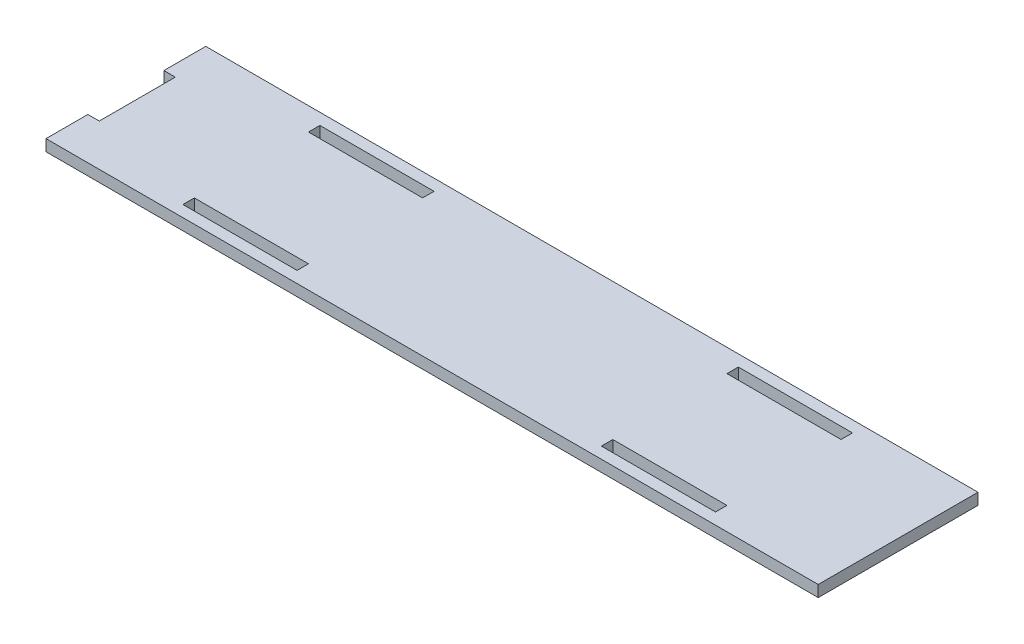
ISO-10303-21;
HEADER;
FILE_DESCRIPTION(('STEP AP214'),'2;1');
FILE_NAME('part.step','',(''),(''),'','','');
FILE_SCHEMA(('AUTOMOTIVE_DESIGN { 1 0 10303 214 1 1 1 1 }'));
ENDSEC;
DATA;
#1=APPLICATION_CONTEXT('core data for automotive mechanical design processes');
#2=APPLICATION_PROTOCOL_DEFINITION('international standard','automotive_design',2000,#1);
#3=PRODUCT_CONTEXT('',#1,'mechanical');
#4=PRODUCT('Part','Part','',(#3));
#5=PRODUCT_RELATED_PRODUCT_CATEGORY('part','',(#4));
#6=PRODUCT_DEFINITION_FORMATION('','',#4);
#7=PRODUCT_DEFINITION_CONTEXT('part definition',#1,'design');
#8=PRODUCT_DEFINITION('design','',#6,#7);
#9=PRODUCT_DEFINITION_SHAPE('','',#8);
#10=(LENGTH_UNIT() NAMED_UNIT(*) SI_UNIT(.MILLI.,.METRE.));
#11=(NAMED_UNIT(*) PLANE_ANGLE_UNIT() SI_UNIT($,.RADIAN.));
#12=(NAMED_UNIT(*) SI_UNIT($,.STERADIAN.) SOLID_ANGLE_UNIT());
#13=UNCERTAINTY_MEASURE_WITH_UNIT(LENGTH_MEASURE(1.E-05),#10,'distance_accuracy_value','');
#14=(GEOMETRIC_REPRESENTATION_CONTEXT(3) GLOBAL_UNCERTAINTY_ASSIGNED_CONTEXT((#13)) GLOBAL_UNIT_ASSIGNED_CONTEXT((#10,
#11,#12)) REPRESENTATION_CONTEXT('',''));
#15=CARTESIAN_POINT('',(0.,0.,0.));
#16=DIRECTION('',(0.,0.,1.));
#17=DIRECTION('',(1.,0.,0.));
#18=AXIS2_PLACEMENT_3D('',#15,#16,#17);
#19=CARTESIAN_POINT('',(0.,3.,0.));
#20=DIRECTION('',(0.,-1.,0.));
#21=DIRECTION('',(0.,0.,-1.));
#22=AXIS2_PLACEMENT_3D('',#19,#20,#21);
#23=PLANE('',#22);
#24=DIRECTION('',(1.,0.,0.));
#25=VECTOR('',#24,1.);
#26=CARTESIAN_POINT('',(143.,3.,-36.));
#27=LINE('',#26,#25);
#28=CARTESIAN_POINT('',(143.,3.,-36.));
#29=VERTEX_POINT('',#28);
#30=CARTESIAN_POINT('',(173.,3.,-36.));
#31=VERTEX_POINT('',#30);
#32=EDGE_CURVE('E230',#29,#31,#27,.T.);
#33=ORIENTED_EDGE('',*,*,#32,.F.);
#34=DIRECTION('',(0.,0.,1.));
#35=VECTOR('',#34,1.);
#36=CARTESIAN_POINT('',(143.,3.,-36.));
#37=LINE('',#36,#35);
#38=CARTESIAN_POINT('',(143.,3.,-39.));
#39=VERTEX_POINT('',#38);
#40=EDGE_CURVE('E238',#39,#29,#37,.T.);
#41=ORIENTED_EDGE('',*,*,#40,.F.);
#42=DIRECTION('',(-1.,0.,0.));
#43=VECTOR('',#42,1.);
#44=CARTESIAN_POINT('',(143.,3.,-39.));
#45=LINE('',#44,#43);
#46=CARTESIAN_POINT('',(173.,3.,-39.));
#47=VERTEX_POINT('',#46);
#48=EDGE_CURVE('E235',#47,#39,#45,.T.);
#49=ORIENTED_EDGE('',*,*,#48,.F.);
#50=DIRECTION('',(0.,0.,-1.));
#51=VECTOR('',#50,1.);
#52=CARTESIAN_POINT('',(173.,3.,-36.));
#53=LINE('',#52,#51);
#54=EDGE_CURVE('E232',#31,#47,#53,.T.);
#55=ORIENTED_EDGE('',*,*,#54,.F.);
#56=EDGE_LOOP('',(#33,#41,#49,#55));
#57=FACE_BOUND('',#56,.T.);
#58=DIRECTION('',(0.,0.,1.));
#59=VECTOR('',#58,1.);
#60=CARTESIAN_POINT('',(33.,3.,-6.));
#61=LINE('',#60,#59);
#62=CARTESIAN_POINT('',(33.,3.,-6.));
#63=VERTEX_POINT('',#62);
#64=CARTESIAN_POINT('',(33.,3.,-3.));
#65=VERTEX_POINT('',#64);
#66=EDGE_CURVE('E292',#63,#65,#61,.T.);
#67=ORIENTED_EDGE('',*,*,#66,.F.);
#68=DIRECTION('',(-1.,0.,0.));
#69=VECTOR('',#68,1.);
#70=CARTESIAN_POINT('',(33.,3.,-6.));
#71=LINE('',#70,#69);
#72=CARTESIAN_POINT('',(63.,3.,-6.));
#73=VERTEX_POINT('',#72);
#74=EDGE_CURVE('E300',#73,#63,#71,.T.);
#75=ORIENTED_EDGE('',*,*,#74,.F.);
#76=DIRECTION('',(0.,0.,-1.));
#77=VECTOR('',#76,1.);
#78=CARTESIAN_POINT('',(63.,3.,-6.));
#79=LINE('',#78,#77);
#80=CARTESIAN_POINT('',(63.,3.,-3.));
#81=VERTEX_POINT('',#80);
#82=EDGE_CURVE('E297',#81,#73,#79,.T.);
#83=ORIENTED_EDGE('',*,*,#82,.F.);
#84=DIRECTION('',(1.,0.,0.));
#85=VECTOR('',#84,1.);
#86=CARTESIAN_POINT('',(33.,3.,-3.));
#87=LINE('',#86,#85);
#88=EDGE_CURVE('E294',#65,#81,#87,.T.);
#89=ORIENTED_EDGE('',*,*,#88,.F.);
#90=EDGE_LOOP('',(#67,#75,#83,#89));
#91=FACE_BOUND('',#90,.T.);
#92=DIRECTION('',(0.,0.,1.));
#93=VECTOR('',#92,1.);
#94=CARTESIAN_POINT('',(0.,3.,0.));
#95=LINE('',#94,#93);
#96=CARTESIAN_POINT('',(0.,3.,-11.));
#97=VERTEX_POINT('',#96);
#98=CARTESIAN_POINT('',(0.,3.,0.));
#99=VERTEX_POINT('',#98);
#100=EDGE_CURVE('E323',#97,#99,#95,.T.);
#101=ORIENTED_EDGE('',*,*,#100,.T.);
#102=DIRECTION('',(1.,0.,0.));
#103=VECTOR('',#102,1.);
#104=CARTESIAN_POINT('',(0.,3.,0.));
#105=LINE('',#104,#103);
#106=CARTESIAN_POINT('',(203.,3.,0.));
#107=VERTEX_POINT('',#106);
#108=EDGE_CURVE('E326',#99,#107,#105,.T.);
#109=ORIENTED_EDGE('',*,*,#108,.T.);
#110=DIRECTION('',(0.,0.,-1.));
#111=VECTOR('',#110,1.);
#112=CARTESIAN_POINT('',(203.,3.,0.));
#113=LINE('',#112,#111);
#114=CARTESIAN_POINT('',(203.,3.,-42.));
#115=VERTEX_POINT('',#114);
#116=EDGE_CURVE('E329',#107,#115,#113,.T.);
#117=ORIENTED_EDGE('',*,*,#116,.T.);
#118=DIRECTION('',(-1.,0.,0.));
#119=VECTOR('',#118,1.);
#120=CARTESIAN_POINT('',(0.,3.,-42.));
#121=LINE('',#120,#119);
#122=CARTESIAN_POINT('',(0.,3.,-42.));
#123=VERTEX_POINT('',#122);
#124=EDGE_CURVE('E331',#115,#123,#121,.T.);
#125=ORIENTED_EDGE('',*,*,#124,.T.);
#126=DIRECTION('',(0.,0.,1.));
#127=VECTOR('',#126,1.);
#128=CARTESIAN_POINT('',(0.,3.,-31.));
#129=LINE('',#128,#127);
#130=CARTESIAN_POINT('',(0.,3.,-31.));
#131=VERTEX_POINT('',#130);
#132=EDGE_CURVE('E333',#123,#131,#129,.T.);
#133=ORIENTED_EDGE('',*,*,#132,.T.);
#134=DIRECTION('',(1.,0.,0.));
#135=VECTOR('',#134,1.);
#136=CARTESIAN_POINT('',(0.,3.,-31.));
#137=LINE('',#136,#135);
#138=CARTESIAN_POINT('',(3.,3.,-31.));
#139=VERTEX_POINT('',#138);
#140=EDGE_CURVE('E335',#131,#139,#137,.T.);
#141=ORIENTED_EDGE('',*,*,#140,.T.);
#142=DIRECTION('',(0.,0.,1.));
#143=VECTOR('',#142,1.);
#144=CARTESIAN_POINT('',(3.,3.,-31.));
#145=LINE('',#144,#143);
#146=CARTESIAN_POINT('',(3.,3.,-11.));
#147=VERTEX_POINT('',#146);
#148=EDGE_CURVE('E337',#139,#147,#145,.T.);
#149=ORIENTED_EDGE('',*,*,#148,.T.);
#150=DIRECTION('',(-1.,0.,0.));
#151=VECTOR('',#150,1.);
#152=CARTESIAN_POINT('',(0.,3.,-11.));
#153=LINE('',#152,#151);
#154=EDGE_CURVE('E339',#147,#97,#153,.T.);
#155=ORIENTED_EDGE('',*,*,#154,.T.);
#156=EDGE_LOOP('',(#101,#109,#117,#125,#133,#141,#149,#155));
#157=FACE_BOUND('',#156,.T.);
#158=DIRECTION('',(0.,0.,1.));
#159=VECTOR('',#158,1.);
#160=CARTESIAN_POINT('',(143.,3.,-6.));
#161=LINE('',#160,#159);
#162=CARTESIAN_POINT('',(143.,3.,-6.));
#163=VERTEX_POINT('',#162);
#164=CARTESIAN_POINT('',(143.,3.,-3.));
#165=VERTEX_POINT('',#164);
#166=EDGE_CURVE('E261',#163,#165,#161,.T.);
#167=ORIENTED_EDGE('',*,*,#166,.F.);
#168=DIRECTION('',(-1.,0.,0.));
#169=VECTOR('',#168,1.);
#170=CARTESIAN_POINT('',(143.,3.,-6.));
#171=LINE('',#170,#169);
#172=CARTESIAN_POINT('',(173.,3.,-6.));
#173=VERTEX_POINT('',#172);
#174=EDGE_CURVE('E269',#173,#163,#171,.T.);
#175=ORIENTED_EDGE('',*,*,#174,.F.);
#176=DIRECTION('',(0.,0.,-1.));
#177=VECTOR('',#176,1.);
#178=CARTESIAN_POINT('',(173.,3.,-6.));
#179=LINE('',#178,#177);
#180=CARTESIAN_POINT('',(173.,3.,-3.));
#181=VERTEX_POINT('',#180);
#182=EDGE_CURVE('E266',#181,#173,#179,.T.);
#183=ORIENTED_EDGE('',*,*,#182,.F.);
#184=DIRECTION('',(1.,0.,0.));
#185=VECTOR('',#184,1.);
#186=CARTESIAN_POINT('',(143.,3.,-3.));
#187=LINE('',#186,#185);
#188=EDGE_CURVE('E263',#165,#181,#187,.T.);
#189=ORIENTED_EDGE('',*,*,#188,.F.);
#190=EDGE_LOOP('',(#167,#175,#183,#189));
#191=FACE_BOUND('',#190,.T.);
#192=DIRECTION('',(1.,0.,0.));
#193=VECTOR('',#192,1.);
#194=CARTESIAN_POINT('',(33.,3.,-36.));
#195=LINE('',#194,#193);
#196=CARTESIAN_POINT('',(33.,3.,-36.));
#197=VERTEX_POINT('',#196);
#198=CARTESIAN_POINT('',(63.,3.,-36.));
#199=VERTEX_POINT('',#198);
#200=EDGE_CURVE('E194',#197,#199,#195,.T.);
#201=ORIENTED_EDGE('',*,*,#200,.F.);
#202=DIRECTION('',(0.,0.,1.));
#203=VECTOR('',#202,1.);
#204=CARTESIAN_POINT('',(33.,3.,-36.));
#205=LINE('',#204,#203);
#206=CARTESIAN_POINT('',(33.,3.,-39.));
#207=VERTEX_POINT('',#206);
#208=EDGE_CURVE('E216',#207,#197,#205,.T.);
#209=ORIENTED_EDGE('',*,*,#208,.F.);
#210=DIRECTION('',(-1.,0.,0.));
#211=VECTOR('',#210,1.);
#212=CARTESIAN_POINT('',(33.,3.,-39.));
#213=LINE('',#212,#211);
#214=CARTESIAN_POINT('',(63.,3.,-39.));
#215=VERTEX_POINT('',#214);
#216=EDGE_CURVE('E214',#215,#207,#213,.T.);
#217=ORIENTED_EDGE('',*,*,#216,.F.);
#218=DIRECTION('',(0.,0.,-1.));
#219=VECTOR('',#218,1.);
#220=CARTESIAN_POINT('',(63.,3.,-36.));
#221=LINE('',#220,#219);
#222=EDGE_CURVE('E202',#199,#215,#221,.T.);
#223=ORIENTED_EDGE('',*,*,#222,.F.);
#224=EDGE_LOOP('',(#201,#209,#217,#223));
#225=FACE_BOUND('',#224,.T.);
#226=ADVANCED_FACE('F33',(#57,#91,#157,#191,#225),#23,.F.);
#227=CARTESIAN_POINT('',(0.,0.,0.));
#228=DIRECTION('',(0.,-1.,0.));
#229=DIRECTION('',(0.,0.,-1.));
#230=AXIS2_PLACEMENT_3D('',#227,#228,#229);
#231=PLANE('',#230);
#232=DIRECTION('',(0.,0.,1.));
#233=VECTOR('',#232,1.);
#234=CARTESIAN_POINT('',(0.,0.,0.));
#235=LINE('',#234,#233);
#236=CARTESIAN_POINT('',(0.,0.,-11.));
#237=VERTEX_POINT('',#236);
#238=CARTESIAN_POINT('',(0.,0.,0.));
#239=VERTEX_POINT('',#238);
#240=EDGE_CURVE('E322',#237,#239,#235,.T.);
#241=ORIENTED_EDGE('',*,*,#240,.F.);
#242=DIRECTION('',(-1.,0.,0.));
#243=VECTOR('',#242,1.);
#244=CARTESIAN_POINT('',(0.,0.,-11.));
#245=LINE('',#244,#243);
#246=CARTESIAN_POINT('',(3.,0.,-11.));
#247=VERTEX_POINT('',#246);
#248=EDGE_CURVE('E327',#247,#237,#245,.T.);
#249=ORIENTED_EDGE('',*,*,#248,.F.);
#250=DIRECTION('',(0.,0.,1.));
#251=VECTOR('',#250,1.);
#252=CARTESIAN_POINT('',(3.,0.,-31.));
#253=LINE('',#252,#251);
#254=CARTESIAN_POINT('',(3.,0.,-31.));
#255=VERTEX_POINT('',#254);
#256=EDGE_CURVE('E354',#255,#247,#253,.T.);
#257=ORIENTED_EDGE('',*,*,#256,.F.);
#258=DIRECTION('',(1.,0.,0.));
#259=VECTOR('',#258,1.);
#260=CARTESIAN_POINT('',(0.,0.,-31.));
#261=LINE('',#260,#259);
#262=CARTESIAN_POINT('',(0.,0.,-31.));
#263=VERTEX_POINT('',#262);
#264=EDGE_CURVE('E352',#263,#255,#261,.T.);
#265=ORIENTED_EDGE('',*,*,#264,.F.);
#266=DIRECTION('',(0.,0.,1.));
#267=VECTOR('',#266,1.);
#268=CARTESIAN_POINT('',(0.,0.,-31.));
#269=LINE('',#268,#267);
#270=CARTESIAN_POINT('',(0.,0.,-42.));
#271=VERTEX_POINT('',#270);
#272=EDGE_CURVE('E350',#271,#263,#269,.T.);
#273=ORIENTED_EDGE('',*,*,#272,.F.);
#274=DIRECTION('',(-1.,0.,0.));
#275=VECTOR('',#274,1.);
#276=CARTESIAN_POINT('',(0.,0.,-42.));
#277=LINE('',#276,#275);
#278=CARTESIAN_POINT('',(203.,0.,-42.));
#279=VERTEX_POINT('',#278);
#280=EDGE_CURVE('E348',#279,#271,#277,.T.);
#281=ORIENTED_EDGE('',*,*,#280,.F.);
#282=DIRECTION('',(0.,0.,-1.));
#283=VECTOR('',#282,1.);
#284=CARTESIAN_POINT('',(203.,0.,0.));
#285=LINE('',#284,#283);
#286=CARTESIAN_POINT('',(203.,0.,0.));
#287=VERTEX_POINT('',#286);
#288=EDGE_CURVE('E346',#287,#279,#285,.T.);
#289=ORIENTED_EDGE('',*,*,#288,.F.);
#290=DIRECTION('',(1.,0.,0.));
#291=VECTOR('',#290,1.);
#292=CARTESIAN_POINT('',(0.,0.,0.));
#293=LINE('',#292,#291);
#294=EDGE_CURVE('E344',#239,#287,#293,.T.);
#295=ORIENTED_EDGE('',*,*,#294,.F.);
#296=EDGE_LOOP('',(#241,#249,#257,#265,#273,#281,#289,#295));
#297=FACE_BOUND('',#296,.T.);
#298=DIRECTION('',(-1.,0.,0.));
#299=VECTOR('',#298,1.);
#300=CARTESIAN_POINT('',(33.,0.,-6.));
#301=LINE('',#300,#299);
#302=CARTESIAN_POINT('',(63.,0.,-6.));
#303=VERTEX_POINT('',#302);
#304=CARTESIAN_POINT('',(33.,0.,-6.));
#305=VERTEX_POINT('',#304);
#306=EDGE_CURVE('E295',#303,#305,#301,.T.);
#307=ORIENTED_EDGE('',*,*,#306,.T.);
#308=DIRECTION('',(0.,0.,1.));
#309=VECTOR('',#308,1.);
#310=CARTESIAN_POINT('',(33.,0.,-6.));
#311=LINE('',#310,#309);
#312=CARTESIAN_POINT('',(33.,0.,-3.));
#313=VERTEX_POINT('',#312);
#314=EDGE_CURVE('E291',#305,#313,#311,.T.);
#315=ORIENTED_EDGE('',*,*,#314,.T.);
#316=DIRECTION('',(1.,0.,0.));
#317=VECTOR('',#316,1.);
#318=CARTESIAN_POINT('',(33.,0.,-3.));
#319=LINE('',#318,#317);
#320=CARTESIAN_POINT('',(63.,0.,-3.));
#321=VERTEX_POINT('',#320);
#322=EDGE_CURVE('E305',#313,#321,#319,.T.);
#323=ORIENTED_EDGE('',*,*,#322,.T.);
#324=DIRECTION('',(0.,0.,-1.));
#325=VECTOR('',#324,1.);
#326=CARTESIAN_POINT('',(63.,0.,-6.));
#327=LINE('',#326,#325);
#328=EDGE_CURVE('E308',#321,#303,#327,.T.);
#329=ORIENTED_EDGE('',*,*,#328,.T.);
#330=EDGE_LOOP('',(#307,#315,#323,#329));
#331=FACE_BOUND('',#330,.T.);
#332=DIRECTION('',(-1.,0.,0.));
#333=VECTOR('',#332,1.);
#334=CARTESIAN_POINT('',(143.,0.,-6.));
#335=LINE('',#334,#333);
#336=CARTESIAN_POINT('',(173.,0.,-6.));
#337=VERTEX_POINT('',#336);
#338=CARTESIAN_POINT('',(143.,0.,-6.));
#339=VERTEX_POINT('',#338);
#340=EDGE_CURVE('E264',#337,#339,#335,.T.);
#341=ORIENTED_EDGE('',*,*,#340,.T.);
#342=DIRECTION('',(0.,0.,1.));
#343=VECTOR('',#342,1.);
#344=CARTESIAN_POINT('',(143.,0.,-6.));
#345=LINE('',#344,#343);
#346=CARTESIAN_POINT('',(143.,0.,-3.));
#347=VERTEX_POINT('',#346);
#348=EDGE_CURVE('E260',#339,#347,#345,.T.);
#349=ORIENTED_EDGE('',*,*,#348,.T.);
#350=DIRECTION('',(1.,0.,0.));
#351=VECTOR('',#350,1.);
#352=CARTESIAN_POINT('',(143.,0.,-3.));
#353=LINE('',#352,#351);
#354=CARTESIAN_POINT('',(173.,0.,-3.));
#355=VERTEX_POINT('',#354);
#356=EDGE_CURVE('E274',#347,#355,#353,.T.);
#357=ORIENTED_EDGE('',*,*,#356,.T.);
#358=DIRECTION('',(0.,0.,-1.));
#359=VECTOR('',#358,1.);
#360=CARTESIAN_POINT('',(173.,0.,-6.));
#361=LINE('',#360,#359);
#362=EDGE_CURVE('E277',#355,#337,#361,.T.);
#363=ORIENTED_EDGE('',*,*,#362,.T.);
#364=EDGE_LOOP('',(#341,#349,#357,#363));
#365=FACE_BOUND('',#364,.T.);
#366=DIRECTION('',(0.,0.,1.));
#367=VECTOR('',#366,1.);
#368=CARTESIAN_POINT('',(143.,0.,-36.));
#369=LINE('',#368,#367);
#370=CARTESIAN_POINT('',(143.,0.,-39.));
#371=VERTEX_POINT('',#370);
#372=CARTESIAN_POINT('',(143.,0.,-36.));
#373=VERTEX_POINT('',#372);
#374=EDGE_CURVE('E233',#371,#373,#369,.T.);
#375=ORIENTED_EDGE('',*,*,#374,.T.);
#376=DIRECTION('',(1.,0.,0.));
#377=VECTOR('',#376,1.);
#378=CARTESIAN_POINT('',(143.,0.,-36.));
#379=LINE('',#378,#377);
#380=CARTESIAN_POINT('',(173.,0.,-36.));
#381=VERTEX_POINT('',#380);
#382=EDGE_CURVE('E210',#373,#381,#379,.T.);
#383=ORIENTED_EDGE('',*,*,#382,.T.);
#384=DIRECTION('',(0.,0.,-1.));
#385=VECTOR('',#384,1.);
#386=CARTESIAN_POINT('',(173.,0.,-36.));
#387=LINE('',#386,#385);
#388=CARTESIAN_POINT('',(173.,0.,-39.));
#389=VERTEX_POINT('',#388);
#390=EDGE_CURVE('E243',#381,#389,#387,.T.);
#391=ORIENTED_EDGE('',*,*,#390,.T.);
#392=DIRECTION('',(-1.,0.,0.));
#393=VECTOR('',#392,1.);
#394=CARTESIAN_POINT('',(143.,0.,-39.));
#395=LINE('',#394,#393);
#396=EDGE_CURVE('E246',#389,#371,#395,.T.);
#397=ORIENTED_EDGE('',*,*,#396,.T.);
#398=EDGE_LOOP('',(#375,#383,#391,#397));
#399=FACE_BOUND('',#398,.T.);
#400=DIRECTION('',(0.,0.,1.));
#401=VECTOR('',#400,1.);
#402=CARTESIAN_POINT('',(33.,0.,-36.));
#403=LINE('',#402,#401);
#404=CARTESIAN_POINT('',(33.,0.,-39.));
#405=VERTEX_POINT('',#404);
#406=CARTESIAN_POINT('',(33.,0.,-36.));
#407=VERTEX_POINT('',#406);
#408=EDGE_CURVE('E203',#405,#407,#403,.T.);
#409=ORIENTED_EDGE('',*,*,#408,.T.);
#410=DIRECTION('',(1.,0.,0.));
#411=VECTOR('',#410,1.);
#412=CARTESIAN_POINT('',(33.,0.,-36.));
#413=LINE('',#412,#411);
#414=CARTESIAN_POINT('',(63.,0.,-36.));
#415=VERTEX_POINT('',#414);
#416=EDGE_CURVE('E56',#407,#415,#413,.T.);
#417=ORIENTED_EDGE('',*,*,#416,.T.);
#418=DIRECTION('',(0.,0.,-1.));
#419=VECTOR('',#418,1.);
#420=CARTESIAN_POINT('',(63.,0.,-36.));
#421=LINE('',#420,#419);
#422=CARTESIAN_POINT('',(63.,0.,-39.));
#423=VERTEX_POINT('',#422);
#424=EDGE_CURVE('E209',#415,#423,#421,.T.);
#425=ORIENTED_EDGE('',*,*,#424,.T.);
#426=DIRECTION('',(-1.,0.,0.));
#427=VECTOR('',#426,1.);
#428=CARTESIAN_POINT('',(33.,0.,-39.));
#429=LINE('',#428,#427);
#430=EDGE_CURVE('E222',#423,#405,#429,.T.);
#431=ORIENTED_EDGE('',*,*,#430,.T.);
#432=EDGE_LOOP('',(#409,#417,#425,#431));
#433=FACE_BOUND('',#432,.T.);
#434=ADVANCED_FACE('F384',(#297,#331,#365,#399,#433),#231,.T.);
#435=CARTESIAN_POINT('',(0.,3.,0.));
#436=DIRECTION('',(1.,0.,0.));
#437=DIRECTION('',(0.,0.,-1.));
#438=AXIS2_PLACEMENT_3D('',#435,#436,#437);
#439=PLANE('',#438);
#440=ORIENTED_EDGE('',*,*,#240,.T.);
#441=DIRECTION('',(0.,-1.,0.));
#442=VECTOR('',#441,1.);
#443=CARTESIAN_POINT('',(0.,3.,0.));
#444=LINE('',#443,#442);
#445=EDGE_CURVE('E11',#99,#239,#444,.T.);
#446=ORIENTED_EDGE('',*,*,#445,.F.);
#447=ORIENTED_EDGE('',*,*,#100,.F.);
#448=DIRECTION('',(0.,-1.,0.));
#449=VECTOR('',#448,1.);
#450=CARTESIAN_POINT('',(0.,3.,-11.));
#451=LINE('',#450,#449);
#452=EDGE_CURVE('E341',#97,#237,#451,.T.);
#453=ORIENTED_EDGE('',*,*,#452,.T.);
#454=EDGE_LOOP('',(#440,#446,#447,#453));
#455=FACE_BOUND('',#454,.T.);
#456=ADVANCED_FACE('F35',(#455),#439,.F.);
#457=CARTESIAN_POINT('',(0.,3.,0.));
#458=DIRECTION('',(0.,0.,-1.));
#459=DIRECTION('',(-1.,0.,0.));
#460=AXIS2_PLACEMENT_3D('',#457,#458,#459);
#461=PLANE('',#460);
#462=ORIENTED_EDGE('',*,*,#294,.T.);
#463=DIRECTION('',(0.,-1.,0.));
#464=VECTOR('',#463,1.);
#465=CARTESIAN_POINT('',(203.,3.,0.));
#466=LINE('',#465,#464);
#467=EDGE_CURVE('E41',#107,#287,#466,.T.);
#468=ORIENTED_EDGE('',*,*,#467,.F.);
#469=ORIENTED_EDGE('',*,*,#108,.F.);
#470=ORIENTED_EDGE('',*,*,#445,.T.);
#471=EDGE_LOOP('',(#462,#468,#469,#470));
#472=FACE_BOUND('',#471,.T.);
#473=ADVANCED_FACE('F402',(#472),#461,.F.);
#474=CARTESIAN_POINT('',(203.,3.,0.));
#475=DIRECTION('',(-1.,0.,0.));
#476=DIRECTION('',(0.,0.,1.));
#477=AXIS2_PLACEMENT_3D('',#474,#475,#476);
#478=PLANE('',#477);
#479=ORIENTED_EDGE('',*,*,#288,.T.);
#480=DIRECTION('',(0.,-1.,0.));
#481=VECTOR('',#480,1.);
#482=CARTESIAN_POINT('',(203.,3.,-42.));
#483=LINE('',#482,#481);
#484=EDGE_CURVE('E371',#115,#279,#483,.T.);
#485=ORIENTED_EDGE('',*,*,#484,.F.);
#486=ORIENTED_EDGE('',*,*,#116,.F.);
#487=ORIENTED_EDGE('',*,*,#467,.T.);
#488=EDGE_LOOP('',(#479,#485,#486,#487));
#489=FACE_BOUND('',#488,.T.);
#490=ADVANCED_FACE('F378',(#489),#478,.F.);
#491=CARTESIAN_POINT('',(0.,3.,-42.));
#492=DIRECTION('',(0.,0.,1.));
#493=DIRECTION('',(1.,0.,0.));
#494=AXIS2_PLACEMENT_3D('',#491,#492,#493);
#495=PLANE('',#494);
#496=ORIENTED_EDGE('',*,*,#280,.T.);
#497=DIRECTION('',(0.,-1.,0.));
#498=VECTOR('',#497,1.);
#499=CARTESIAN_POINT('',(0.,3.,-42.));
#500=LINE('',#499,#498);
#501=EDGE_CURVE('E368',#123,#271,#500,.T.);
#502=ORIENTED_EDGE('',*,*,#501,.F.);
#503=ORIENTED_EDGE('',*,*,#124,.F.);
#504=ORIENTED_EDGE('',*,*,#484,.T.);
#505=EDGE_LOOP('',(#496,#502,#503,#504));
#506=FACE_BOUND('',#505,.T.);
#507=ADVANCED_FACE('F390',(#506),#495,.F.);
#508=CARTESIAN_POINT('',(0.,3.,-31.));
#509=DIRECTION('',(1.,0.,0.));
#510=DIRECTION('',(0.,0.,-1.));
#511=AXIS2_PLACEMENT_3D('',#508,#509,#510);
#512=PLANE('',#511);
#513=ORIENTED_EDGE('',*,*,#272,.T.);
#514=DIRECTION('',(0.,-1.,0.));
#515=VECTOR('',#514,1.);
#516=CARTESIAN_POINT('',(0.,3.,-31.));
#517=LINE('',#516,#515);
#518=EDGE_CURVE('E365',#131,#263,#517,.T.);
#519=ORIENTED_EDGE('',*,*,#518,.F.);
#520=ORIENTED_EDGE('',*,*,#132,.F.);
#521=ORIENTED_EDGE('',*,*,#501,.T.);
#522=EDGE_LOOP('',(#513,#519,#520,#521));
#523=FACE_BOUND('',#522,.T.);
#524=ADVANCED_FACE('F394',(#523),#512,.F.);
#525=CARTESIAN_POINT('',(0.,3.,-31.));
#526=DIRECTION('',(0.,0.,-1.));
#527=DIRECTION('',(-1.,0.,0.));
#528=AXIS2_PLACEMENT_3D('',#525,#526,#527);
#529=PLANE('',#528);
#530=ORIENTED_EDGE('',*,*,#264,.T.);
#531=DIRECTION('',(0.,-1.,0.));
#532=VECTOR('',#531,1.);
#533=CARTESIAN_POINT('',(3.,3.,-31.));
#534=LINE('',#533,#532);
#535=EDGE_CURVE('E362',#139,#255,#534,.T.);
#536=ORIENTED_EDGE('',*,*,#535,.F.);
#537=ORIENTED_EDGE('',*,*,#140,.F.);
#538=ORIENTED_EDGE('',*,*,#518,.T.);
#539=EDGE_LOOP('',(#530,#536,#537,#538));
#540=FACE_BOUND('',#539,.T.);
#541=ADVANCED_FACE('F415',(#540),#529,.F.);
#542=CARTESIAN_POINT('',(3.,3.,-31.));
#543=DIRECTION('',(1.,0.,0.));
#544=DIRECTION('',(0.,0.,-1.));
#545=AXIS2_PLACEMENT_3D('',#542,#543,#544);
#546=PLANE('',#545);
#547=ORIENTED_EDGE('',*,*,#256,.T.);
#548=DIRECTION('',(0.,-1.,0.));
#549=VECTOR('',#548,1.);
#550=CARTESIAN_POINT('',(3.,3.,-11.));
#551=LINE('',#550,#549);
#552=EDGE_CURVE('E359',#147,#247,#551,.T.);
#553=ORIENTED_EDGE('',*,*,#552,.F.);
#554=ORIENTED_EDGE('',*,*,#148,.F.);
#555=ORIENTED_EDGE('',*,*,#535,.T.);
#556=EDGE_LOOP('',(#547,#553,#554,#555));
#557=FACE_BOUND('',#556,.T.);
#558=ADVANCED_FACE('F413',(#557),#546,.F.);
#559=CARTESIAN_POINT('',(0.,3.,-11.));
#560=DIRECTION('',(0.,0.,1.));
#561=DIRECTION('',(1.,0.,0.));
#562=AXIS2_PLACEMENT_3D('',#559,#560,#561);
#563=PLANE('',#562);
#564=ORIENTED_EDGE('',*,*,#248,.T.);
#565=ORIENTED_EDGE('',*,*,#452,.F.);
#566=ORIENTED_EDGE('',*,*,#154,.F.);
#567=ORIENTED_EDGE('',*,*,#552,.T.);
#568=EDGE_LOOP('',(#564,#565,#566,#567));
#569=FACE_BOUND('',#568,.T.);
#570=ADVANCED_FACE('F408',(#569),#563,.F.);
#571=CARTESIAN_POINT('',(33.,3.,-6.));
#572=DIRECTION('',(1.,0.,0.));
#573=DIRECTION('',(0.,0.,-1.));
#574=AXIS2_PLACEMENT_3D('',#571,#572,#573);
#575=PLANE('',#574);
#576=ORIENTED_EDGE('',*,*,#314,.F.);
#577=DIRECTION('',(0.,-1.,0.));
#578=VECTOR('',#577,1.);
#579=CARTESIAN_POINT('',(33.,3.,-6.));
#580=LINE('',#579,#578);
#581=EDGE_CURVE('E302',#63,#305,#580,.T.);
#582=ORIENTED_EDGE('',*,*,#581,.F.);
#583=ORIENTED_EDGE('',*,*,#66,.T.);
#584=DIRECTION('',(0.,-1.,0.));
#585=VECTOR('',#584,1.);
#586=CARTESIAN_POINT('',(33.,3.,-3.));
#587=LINE('',#586,#585);
#588=EDGE_CURVE('E319',#65,#313,#587,.T.);
#589=ORIENTED_EDGE('',*,*,#588,.T.);
#590=EDGE_LOOP('',(#576,#582,#583,#589));
#591=FACE_BOUND('',#590,.T.);
#592=ADVANCED_FACE('F434',(#591),#575,.T.);
#593=CARTESIAN_POINT('',(33.,3.,-3.));
#594=DIRECTION('',(0.,0.,-1.));
#595=DIRECTION('',(-1.,0.,0.));
#596=AXIS2_PLACEMENT_3D('',#593,#594,#595);
#597=PLANE('',#596);
#598=ORIENTED_EDGE('',*,*,#322,.F.);
#599=ORIENTED_EDGE('',*,*,#588,.F.);
#600=ORIENTED_EDGE('',*,*,#88,.T.);
#601=DIRECTION('',(0.,-1.,0.));
#602=VECTOR('',#601,1.);
#603=CARTESIAN_POINT('',(63.,3.,-3.));
#604=LINE('',#603,#602);
#605=EDGE_CURVE('E317',#81,#321,#604,.T.);
#606=ORIENTED_EDGE('',*,*,#605,.T.);
#607=EDGE_LOOP('',(#598,#599,#600,#606));
#608=FACE_BOUND('',#607,.T.);
#609=ADVANCED_FACE('F441',(#608),#597,.T.);
#610=CARTESIAN_POINT('',(63.,3.,-6.));
#611=DIRECTION('',(-1.,0.,0.));
#612=DIRECTION('',(0.,0.,1.));
#613=AXIS2_PLACEMENT_3D('',#610,#611,#612);
#614=PLANE('',#613);
#615=ORIENTED_EDGE('',*,*,#328,.F.);
#616=ORIENTED_EDGE('',*,*,#605,.F.);
#617=ORIENTED_EDGE('',*,*,#82,.T.);
#618=DIRECTION('',(0.,-1.,0.));
#619=VECTOR('',#618,1.);
#620=CARTESIAN_POINT('',(63.,3.,-6.));
#621=LINE('',#620,#619);
#622=EDGE_CURVE('E315',#73,#303,#621,.T.);
#623=ORIENTED_EDGE('',*,*,#622,.T.);
#624=EDGE_LOOP('',(#615,#616,#617,#623));
#625=FACE_BOUND('',#624,.T.);
#626=ADVANCED_FACE('F446',(#625),#614,.T.);
#627=CARTESIAN_POINT('',(33.,3.,-6.));
#628=DIRECTION('',(0.,0.,1.));
#629=DIRECTION('',(1.,0.,0.));
#630=AXIS2_PLACEMENT_3D('',#627,#628,#629);
#631=PLANE('',#630);
#632=ORIENTED_EDGE('',*,*,#306,.F.);
#633=ORIENTED_EDGE('',*,*,#622,.F.);
#634=ORIENTED_EDGE('',*,*,#74,.T.);
#635=ORIENTED_EDGE('',*,*,#581,.T.);
#636=EDGE_LOOP('',(#632,#633,#634,#635));
#637=FACE_BOUND('',#636,.T.);
#638=ADVANCED_FACE('F453',(#637),#631,.T.);
#639=CARTESIAN_POINT('',(143.,3.,-6.));
#640=DIRECTION('',(1.,0.,0.));
#641=DIRECTION('',(0.,0.,-1.));
#642=AXIS2_PLACEMENT_3D('',#639,#640,#641);
#643=PLANE('',#642);
#644=ORIENTED_EDGE('',*,*,#348,.F.);
#645=DIRECTION('',(0.,-1.,0.));
#646=VECTOR('',#645,1.);
#647=CARTESIAN_POINT('',(143.,3.,-6.));
#648=LINE('',#647,#646);
#649=EDGE_CURVE('E271',#163,#339,#648,.T.);
#650=ORIENTED_EDGE('',*,*,#649,.F.);
#651=ORIENTED_EDGE('',*,*,#166,.T.);
#652=DIRECTION('',(0.,-1.,0.));
#653=VECTOR('',#652,1.);
#654=CARTESIAN_POINT('',(143.,3.,-3.));
#655=LINE('',#654,#653);
#656=EDGE_CURVE('E288',#165,#347,#655,.T.);
#657=ORIENTED_EDGE('',*,*,#656,.T.);
#658=EDGE_LOOP('',(#644,#650,#651,#657));
#659=FACE_BOUND('',#658,.T.);
#660=ADVANCED_FACE('F466',(#659),#643,.T.);
#661=CARTESIAN_POINT('',(143.,3.,-3.));
#662=DIRECTION('',(0.,0.,-1.));
#663=DIRECTION('',(-1.,0.,0.));
#664=AXIS2_PLACEMENT_3D('',#661,#662,#663);
#665=PLANE('',#664);
#666=ORIENTED_EDGE('',*,*,#356,.F.);
#667=ORIENTED_EDGE('',*,*,#656,.F.);
#668=ORIENTED_EDGE('',*,*,#188,.T.);
#669=DIRECTION('',(0.,-1.,0.));
#670=VECTOR('',#669,1.);
#671=CARTESIAN_POINT('',(173.,3.,-3.));
#672=LINE('',#671,#670);
#673=EDGE_CURVE('E286',#181,#355,#672,.T.);
#674=ORIENTED_EDGE('',*,*,#673,.T.);
#675=EDGE_LOOP('',(#666,#667,#668,#674));
#676=FACE_BOUND('',#675,.T.);
#677=ADVANCED_FACE('F471',(#676),#665,.T.);
#678=CARTESIAN_POINT('',(173.,3.,-6.));
#679=DIRECTION('',(-1.,0.,0.));
#680=DIRECTION('',(0.,0.,1.));
#681=AXIS2_PLACEMENT_3D('',#678,#679,#680);
#682=PLANE('',#681);
#683=ORIENTED_EDGE('',*,*,#362,.F.);
#684=ORIENTED_EDGE('',*,*,#673,.F.);
#685=ORIENTED_EDGE('',*,*,#182,.T.);
#686=DIRECTION('',(0.,-1.,0.));
#687=VECTOR('',#686,1.);
#688=CARTESIAN_POINT('',(173.,3.,-6.));
#689=LINE('',#688,#687);
#690=EDGE_CURVE('E284',#173,#337,#689,.T.);
#691=ORIENTED_EDGE('',*,*,#690,.T.);
#692=EDGE_LOOP('',(#683,#684,#685,#691));
#693=FACE_BOUND('',#692,.T.);
#694=ADVANCED_FACE('F475',(#693),#682,.T.);
#695=CARTESIAN_POINT('',(143.,3.,-6.));
#696=DIRECTION('',(0.,0.,1.));
#697=DIRECTION('',(1.,0.,0.));
#698=AXIS2_PLACEMENT_3D('',#695,#696,#697);
#699=PLANE('',#698);
#700=ORIENTED_EDGE('',*,*,#340,.F.);
#701=ORIENTED_EDGE('',*,*,#690,.F.);
#702=ORIENTED_EDGE('',*,*,#174,.T.);
#703=ORIENTED_EDGE('',*,*,#649,.T.);
#704=EDGE_LOOP('',(#700,#701,#702,#703));
#705=FACE_BOUND('',#704,.T.);
#706=ADVANCED_FACE('F479',(#705),#699,.T.);
#707=CARTESIAN_POINT('',(143.,3.,-36.));
#708=DIRECTION('',(0.,0.,-1.));
#709=DIRECTION('',(-1.,0.,0.));
#710=AXIS2_PLACEMENT_3D('',#707,#708,#709);
#711=PLANE('',#710);
#712=ORIENTED_EDGE('',*,*,#382,.F.);
#713=DIRECTION('',(0.,-1.,0.));
#714=VECTOR('',#713,1.);
#715=CARTESIAN_POINT('',(143.,3.,-36.));
#716=LINE('',#715,#714);
#717=EDGE_CURVE('E240',#29,#373,#716,.T.);
#718=ORIENTED_EDGE('',*,*,#717,.F.);
#719=ORIENTED_EDGE('',*,*,#32,.T.);
#720=DIRECTION('',(0.,-1.,0.));
#721=VECTOR('',#720,1.);
#722=CARTESIAN_POINT('',(173.,3.,-36.));
#723=LINE('',#722,#721);
#724=EDGE_CURVE('E257',#31,#381,#723,.T.);
#725=ORIENTED_EDGE('',*,*,#724,.T.);
#726=EDGE_LOOP('',(#712,#718,#719,#725));
#727=FACE_BOUND('',#726,.T.);
#728=ADVANCED_FACE('F483',(#727),#711,.T.);
#729=CARTESIAN_POINT('',(173.,3.,-36.));
#730=DIRECTION('',(-1.,0.,0.));
#731=DIRECTION('',(0.,0.,1.));
#732=AXIS2_PLACEMENT_3D('',#729,#730,#731);
#733=PLANE('',#732);
#734=ORIENTED_EDGE('',*,*,#390,.F.);
#735=ORIENTED_EDGE('',*,*,#724,.F.);
#736=ORIENTED_EDGE('',*,*,#54,.T.);
#737=DIRECTION('',(0.,-1.,0.));
#738=VECTOR('',#737,1.);
#739=CARTESIAN_POINT('',(173.,3.,-39.));
#740=LINE('',#739,#738);
#741=EDGE_CURVE('E255',#47,#389,#740,.T.);
#742=ORIENTED_EDGE('',*,*,#741,.T.);
#743=EDGE_LOOP('',(#734,#735,#736,#742));
#744=FACE_BOUND('',#743,.T.);
#745=ADVANCED_FACE('F487',(#744),#733,.T.);
#746=CARTESIAN_POINT('',(143.,3.,-39.));
#747=DIRECTION('',(0.,0.,1.));
#748=DIRECTION('',(1.,0.,0.));
#749=AXIS2_PLACEMENT_3D('',#746,#747,#748);
#750=PLANE('',#749);
#751=ORIENTED_EDGE('',*,*,#396,.F.);
#752=ORIENTED_EDGE('',*,*,#741,.F.);
#753=ORIENTED_EDGE('',*,*,#48,.T.);
#754=DIRECTION('',(0.,-1.,0.));
#755=VECTOR('',#754,1.);
#756=CARTESIAN_POINT('',(143.,3.,-39.));
#757=LINE('',#756,#755);
#758=EDGE_CURVE('E253',#39,#371,#757,.T.);
#759=ORIENTED_EDGE('',*,*,#758,.T.);
#760=EDGE_LOOP('',(#751,#752,#753,#759));
#761=FACE_BOUND('',#760,.T.);
#762=ADVANCED_FACE('F491',(#761),#750,.T.);
#763=CARTESIAN_POINT('',(143.,3.,-36.));
#764=DIRECTION('',(1.,0.,0.));
#765=DIRECTION('',(0.,0.,-1.));
#766=AXIS2_PLACEMENT_3D('',#763,#764,#765);
#767=PLANE('',#766);
#768=ORIENTED_EDGE('',*,*,#374,.F.);
#769=ORIENTED_EDGE('',*,*,#758,.F.);
#770=ORIENTED_EDGE('',*,*,#40,.T.);
#771=ORIENTED_EDGE('',*,*,#717,.T.);
#772=EDGE_LOOP('',(#768,#769,#770,#771));
#773=FACE_BOUND('',#772,.T.);
#774=ADVANCED_FACE('F495',(#773),#767,.T.);
#775=CARTESIAN_POINT('',(33.,3.,-36.));
#776=DIRECTION('',(0.,0.,-1.));
#777=DIRECTION('',(-1.,0.,0.));
#778=AXIS2_PLACEMENT_3D('',#775,#776,#777);
#779=PLANE('',#778);
#780=ORIENTED_EDGE('',*,*,#416,.F.);
#781=DIRECTION('',(0.,-1.,0.));
#782=VECTOR('',#781,1.);
#783=CARTESIAN_POINT('',(33.,3.,-36.));
#784=LINE('',#783,#782);
#785=EDGE_CURVE('E198',#197,#407,#784,.T.);
#786=ORIENTED_EDGE('',*,*,#785,.F.);
#787=ORIENTED_EDGE('',*,*,#200,.T.);
#788=DIRECTION('',(0.,-1.,0.));
#789=VECTOR('',#788,1.);
#790=CARTESIAN_POINT('',(63.,3.,-36.));
#791=LINE('',#790,#789);
#792=EDGE_CURVE('E197',#199,#415,#791,.T.);
#793=ORIENTED_EDGE('',*,*,#792,.T.);
#794=EDGE_LOOP('',(#780,#786,#787,#793));
#795=FACE_BOUND('',#794,.T.);
#796=ADVANCED_FACE('F196',(#795),#779,.T.);
#797=CARTESIAN_POINT('',(63.,3.,-36.));
#798=DIRECTION('',(-1.,0.,0.));
#799=DIRECTION('',(0.,0.,1.));
#800=AXIS2_PLACEMENT_3D('',#797,#798,#799);
#801=PLANE('',#800);
#802=ORIENTED_EDGE('',*,*,#424,.F.);
#803=ORIENTED_EDGE('',*,*,#792,.F.);
#804=ORIENTED_EDGE('',*,*,#222,.T.);
#805=DIRECTION('',(0.,-1.,0.));
#806=VECTOR('',#805,1.);
#807=CARTESIAN_POINT('',(63.,3.,-39.));
#808=LINE('',#807,#806);
#809=EDGE_CURVE('E211',#215,#423,#808,.T.);
#810=ORIENTED_EDGE('',*,*,#809,.T.);
#811=EDGE_LOOP('',(#802,#803,#804,#810));
#812=FACE_BOUND('',#811,.T.);
#813=ADVANCED_FACE('F206',(#812),#801,.T.);
#814=CARTESIAN_POINT('',(33.,3.,-39.));
#815=DIRECTION('',(0.,0.,1.));
#816=DIRECTION('',(1.,0.,0.));
#817=AXIS2_PLACEMENT_3D('',#814,#815,#816);
#818=PLANE('',#817);
#819=ORIENTED_EDGE('',*,*,#430,.F.);
#820=ORIENTED_EDGE('',*,*,#809,.F.);
#821=ORIENTED_EDGE('',*,*,#216,.T.);
#822=DIRECTION('',(0.,-1.,0.));
#823=VECTOR('',#822,1.);
#824=CARTESIAN_POINT('',(33.,3.,-39.));
#825=LINE('',#824,#823);
#826=EDGE_CURVE('E48',#207,#405,#825,.T.);
#827=ORIENTED_EDGE('',*,*,#826,.T.);
#828=EDGE_LOOP('',(#819,#820,#821,#827));
#829=FACE_BOUND('',#828,.T.);
#830=ADVANCED_FACE('F504',(#829),#818,.T.);
#831=CARTESIAN_POINT('',(33.,3.,-36.));
#832=DIRECTION('',(1.,0.,0.));
#833=DIRECTION('',(0.,0.,-1.));
#834=AXIS2_PLACEMENT_3D('',#831,#832,#833);
#835=PLANE('',#834);
#836=ORIENTED_EDGE('',*,*,#408,.F.);
#837=ORIENTED_EDGE('',*,*,#826,.F.);
#838=ORIENTED_EDGE('',*,*,#208,.T.);
#839=ORIENTED_EDGE('',*,*,#785,.T.);
#840=EDGE_LOOP('',(#836,#837,#838,#839));
#841=FACE_BOUND('',#840,.T.);
#842=ADVANCED_FACE('F507',(#841),#835,.T.);
#843=CLOSED_SHELL('',(#226,#434,#456,#473,#490,#507,#524,#541,#558,#570,#592,#609,#626,#638,
#660,#677,#694,#706,#728,#745,#762,#774,#796,#813,#830,#842));
#844=MANIFOLD_SOLID_BREP('B2',#843);
#845=ADVANCED_BREP_SHAPE_REPRESENTATION('',(#18,#844),#14);
#846=SHAPE_DEFINITION_REPRESENTATION(#9,#845);
ENDSEC;
END-ISO-10303-21;
